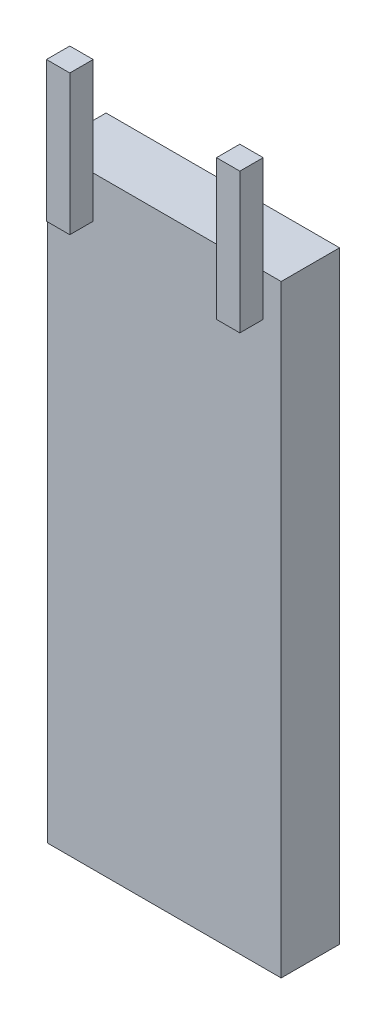
ISO-10303-21;
HEADER;
FILE_DESCRIPTION(('STEP AP214'),'2;1');
FILE_NAME('part.step','',(''),(''),'','','');
FILE_SCHEMA(('AUTOMOTIVE_DESIGN { 1 0 10303 214 1 1 1 1 }'));
ENDSEC;
DATA;
#1=APPLICATION_CONTEXT('core data for automotive mechanical design processes');
#2=APPLICATION_PROTOCOL_DEFINITION('international standard','automotive_design',2000,#1);
#3=PRODUCT_CONTEXT('',#1,'mechanical');
#4=PRODUCT('Part','Part','',(#3));
#5=PRODUCT_RELATED_PRODUCT_CATEGORY('part','',(#4));
#6=PRODUCT_DEFINITION_FORMATION('','',#4);
#7=PRODUCT_DEFINITION_CONTEXT('part definition',#1,'design');
#8=PRODUCT_DEFINITION('design','',#6,#7);
#9=PRODUCT_DEFINITION_SHAPE('','',#8);
#10=(LENGTH_UNIT() NAMED_UNIT(*) SI_UNIT(.MILLI.,.METRE.));
#11=(NAMED_UNIT(*) PLANE_ANGLE_UNIT() SI_UNIT($,.RADIAN.));
#12=(NAMED_UNIT(*) SI_UNIT($,.STERADIAN.) SOLID_ANGLE_UNIT());
#13=UNCERTAINTY_MEASURE_WITH_UNIT(LENGTH_MEASURE(1.E-05),#10,'distance_accuracy_value','');
#14=(GEOMETRIC_REPRESENTATION_CONTEXT(3) GLOBAL_UNCERTAINTY_ASSIGNED_CONTEXT((#13)) GLOBAL_UNIT_ASSIGNED_CONTEXT((#10,
#11,#12)) REPRESENTATION_CONTEXT('',''));
#15=CARTESIAN_POINT('',(0.,0.,0.));
#16=DIRECTION('',(0.,0.,1.));
#17=DIRECTION('',(1.,0.,0.));
#18=AXIS2_PLACEMENT_3D('',#15,#16,#17);
#19=CARTESIAN_POINT('',(0.,0.,0.));
#20=DIRECTION('',(0.,0.,1.));
#21=DIRECTION('',(1.,0.,0.));
#22=AXIS2_PLACEMENT_3D('',#19,#20,#21);
#23=PLANE('',#22);
#24=DIRECTION('',(-1.,0.,0.));
#25=VECTOR('',#24,1.);
#26=CARTESIAN_POINT('',(1.99990671308677,11.5,0.));
#27=LINE('',#26,#25);
#28=CARTESIAN_POINT('',(2.59990671308677,11.5,0.));
#29=VERTEX_POINT('',#28);
#30=CARTESIAN_POINT('',(1.99990671308677,11.5,0.));
#31=VERTEX_POINT('',#30);
#32=EDGE_CURVE('E154',#29,#31,#27,.T.);
#33=ORIENTED_EDGE('',*,*,#32,.T.);
#34=DIRECTION('',(0.,-1.,0.));
#35=VECTOR('',#34,1.);
#36=CARTESIAN_POINT('',(1.99990671308677,15.1,0.));
#37=LINE('',#36,#35);
#38=CARTESIAN_POINT('',(1.99990671308677,12.575,0.));
#39=VERTEX_POINT('',#38);
#40=EDGE_CURVE('E255',#39,#31,#37,.T.);
#41=ORIENTED_EDGE('',*,*,#40,.F.);
#42=DIRECTION('',(1.,0.,0.));
#43=VECTOR('',#42,1.);
#44=CARTESIAN_POINT('',(3.06228777493067,12.575,0.));
#45=LINE('',#44,#43);
#46=CARTESIAN_POINT('',(-1.76899203918877,12.575,0.));
#47=VERTEX_POINT('',#46);
#48=EDGE_CURVE('E251',#47,#39,#45,.T.);
#49=ORIENTED_EDGE('',*,*,#48,.F.);
#50=DIRECTION('',(0.,-1.,0.));
#51=VECTOR('',#50,1.);
#52=CARTESIAN_POINT('',(-1.76899203918877,15.1,0.));
#53=LINE('',#52,#51);
#54=CARTESIAN_POINT('',(-1.76899203918877,11.5,0.));
#55=VERTEX_POINT('',#54);
#56=EDGE_CURVE('E186',#47,#55,#53,.T.);
#57=ORIENTED_EDGE('',*,*,#56,.T.);
#58=DIRECTION('',(-1.,0.,0.));
#59=VECTOR('',#58,1.);
#60=CARTESIAN_POINT('',(-2.36899203918877,11.5,0.));
#61=LINE('',#60,#59);
#62=CARTESIAN_POINT('',(-2.36899203918877,11.5,0.));
#63=VERTEX_POINT('',#62);
#64=EDGE_CURVE('E171',#55,#63,#61,.T.);
#65=ORIENTED_EDGE('',*,*,#64,.T.);
#66=DIRECTION('',(0.,-1.,0.));
#67=VECTOR('',#66,1.);
#68=CARTESIAN_POINT('',(-2.36899203918877,15.1,0.));
#69=LINE('',#68,#67);
#70=CARTESIAN_POINT('',(-2.36899203918877,12.575,0.));
#71=VERTEX_POINT('',#70);
#72=EDGE_CURVE('E176',#71,#63,#69,.T.);
#73=ORIENTED_EDGE('',*,*,#72,.F.);
#74=CARTESIAN_POINT('',(-2.93771222506933,12.575,0.));
#75=VERTEX_POINT('',#74);
#76=EDGE_CURVE('E199',#75,#71,#45,.T.);
#77=ORIENTED_EDGE('',*,*,#76,.F.);
#78=DIRECTION('',(0.,1.,0.));
#79=VECTOR('',#78,1.);
#80=CARTESIAN_POINT('',(-2.93771222506933,-2.925,0.));
#81=LINE('',#80,#79);
#82=CARTESIAN_POINT('',(-2.93771222506933,-2.925,0.));
#83=VERTEX_POINT('',#82);
#84=EDGE_CURVE('E210',#83,#75,#81,.T.);
#85=ORIENTED_EDGE('',*,*,#84,.F.);
#86=DIRECTION('',(-1.,0.,0.));
#87=VECTOR('',#86,1.);
#88=CARTESIAN_POINT('',(3.06228777493067,-2.925,0.));
#89=LINE('',#88,#87);
#90=CARTESIAN_POINT('',(3.06228777493067,-2.925,0.));
#91=VERTEX_POINT('',#90);
#92=EDGE_CURVE('E208',#91,#83,#89,.T.);
#93=ORIENTED_EDGE('',*,*,#92,.F.);
#94=DIRECTION('',(0.,-1.,0.));
#95=VECTOR('',#94,1.);
#96=CARTESIAN_POINT('',(3.06228777493067,-2.925,0.));
#97=LINE('',#96,#95);
#98=CARTESIAN_POINT('',(3.06228777493067,12.575,0.));
#99=VERTEX_POINT('',#98);
#100=EDGE_CURVE('E194',#99,#91,#97,.T.);
#101=ORIENTED_EDGE('',*,*,#100,.F.);
#102=CARTESIAN_POINT('',(2.59990671308677,12.575,0.));
#103=VERTEX_POINT('',#102);
#104=EDGE_CURVE('E212',#103,#99,#45,.T.);
#105=ORIENTED_EDGE('',*,*,#104,.F.);
#106=DIRECTION('',(0.,-1.,0.));
#107=VECTOR('',#106,1.);
#108=CARTESIAN_POINT('',(2.59990671308677,15.1,0.));
#109=LINE('',#108,#107);
#110=EDGE_CURVE('E248',#103,#29,#109,.T.);
#111=ORIENTED_EDGE('',*,*,#110,.T.);
#112=EDGE_LOOP('',(#33,#41,#49,#57,#65,#73,#77,#85,#93,#101,#105,#111));
#113=FACE_BOUND('',#112,.T.);
#114=ADVANCED_FACE('F32',(#113),#23,.T.);
#115=CARTESIAN_POINT('',(3.06228777493067,-2.925,-1.5));
#116=DIRECTION('',(-1.,0.,0.));
#117=DIRECTION('',(0.,0.,1.));
#118=AXIS2_PLACEMENT_3D('',#115,#116,#117);
#119=PLANE('',#118);
#120=ORIENTED_EDGE('',*,*,#100,.T.);
#121=DIRECTION('',(0.,0.,1.));
#122=VECTOR('',#121,1.);
#123=CARTESIAN_POINT('',(3.06228777493067,-2.925,-1.5));
#124=LINE('',#123,#122);
#125=CARTESIAN_POINT('',(3.06228777493067,-2.925,-1.5));
#126=VERTEX_POINT('',#125);
#127=EDGE_CURVE('E11',#126,#91,#124,.T.);
#128=ORIENTED_EDGE('',*,*,#127,.F.);
#129=DIRECTION('',(0.,-1.,0.));
#130=VECTOR('',#129,1.);
#131=CARTESIAN_POINT('',(3.06228777493067,-2.925,-1.5));
#132=LINE('',#131,#130);
#133=CARTESIAN_POINT('',(3.06228777493067,12.575,-1.5));
#134=VERTEX_POINT('',#133);
#135=EDGE_CURVE('E195',#134,#126,#132,.T.);
#136=ORIENTED_EDGE('',*,*,#135,.F.);
#137=DIRECTION('',(0.,0.,1.));
#138=VECTOR('',#137,1.);
#139=CARTESIAN_POINT('',(3.06228777493067,12.575,-1.5));
#140=LINE('',#139,#138);
#141=EDGE_CURVE('E205',#134,#99,#140,.T.);
#142=ORIENTED_EDGE('',*,*,#141,.T.);
#143=EDGE_LOOP('',(#120,#128,#136,#142));
#144=FACE_BOUND('',#143,.T.);
#145=ADVANCED_FACE('F34',(#144),#119,.F.);
#146=CARTESIAN_POINT('',(3.06228777493067,-2.925,-1.5));
#147=DIRECTION('',(0.,1.,0.));
#148=DIRECTION('',(0.,0.,1.));
#149=AXIS2_PLACEMENT_3D('',#146,#147,#148);
#150=PLANE('',#149);
#151=ORIENTED_EDGE('',*,*,#92,.T.);
#152=DIRECTION('',(0.,0.,1.));
#153=VECTOR('',#152,1.);
#154=CARTESIAN_POINT('',(-2.93771222506933,-2.925,-1.5));
#155=LINE('',#154,#153);
#156=CARTESIAN_POINT('',(-2.93771222506933,-2.925,-1.5));
#157=VERTEX_POINT('',#156);
#158=EDGE_CURVE('E40',#157,#83,#155,.T.);
#159=ORIENTED_EDGE('',*,*,#158,.F.);
#160=DIRECTION('',(-1.,0.,0.));
#161=VECTOR('',#160,1.);
#162=CARTESIAN_POINT('',(3.06228777493067,-2.925,-1.5));
#163=LINE('',#162,#161);
#164=EDGE_CURVE('E198',#126,#157,#163,.T.);
#165=ORIENTED_EDGE('',*,*,#164,.F.);
#166=ORIENTED_EDGE('',*,*,#127,.T.);
#167=EDGE_LOOP('',(#151,#159,#165,#166));
#168=FACE_BOUND('',#167,.T.);
#169=ADVANCED_FACE('F243',(#168),#150,.F.);
#170=CARTESIAN_POINT('',(-2.93771222506933,-2.925,-1.5));
#171=DIRECTION('',(1.,0.,0.));
#172=DIRECTION('',(0.,1.,0.));
#173=AXIS2_PLACEMENT_3D('',#170,#171,#172);
#174=PLANE('',#173);
#175=ORIENTED_EDGE('',*,*,#84,.T.);
#176=DIRECTION('',(0.,0.,1.));
#177=VECTOR('',#176,1.);
#178=CARTESIAN_POINT('',(-2.93771222506933,12.575,-1.5));
#179=LINE('',#178,#177);
#180=CARTESIAN_POINT('',(-2.93771222506933,12.575,-1.5));
#181=VERTEX_POINT('',#180);
#182=EDGE_CURVE('E218',#181,#75,#179,.T.);
#183=ORIENTED_EDGE('',*,*,#182,.F.);
#184=DIRECTION('',(0.,1.,0.));
#185=VECTOR('',#184,1.);
#186=CARTESIAN_POINT('',(-2.93771222506933,-2.925,-1.5));
#187=LINE('',#186,#185);
#188=EDGE_CURVE('E201',#157,#181,#187,.T.);
#189=ORIENTED_EDGE('',*,*,#188,.F.);
#190=ORIENTED_EDGE('',*,*,#158,.T.);
#191=EDGE_LOOP('',(#175,#183,#189,#190));
#192=FACE_BOUND('',#191,.T.);
#193=ADVANCED_FACE('F225',(#192),#174,.F.);
#194=CARTESIAN_POINT('',(3.06228777493067,12.575,-1.5));
#195=DIRECTION('',(0.,-1.,0.));
#196=DIRECTION('',(0.,0.,-1.));
#197=AXIS2_PLACEMENT_3D('',#194,#195,#196);
#198=PLANE('',#197);
#199=ORIENTED_EDGE('',*,*,#76,.T.);
#200=EDGE_CURVE('E215',#71,#47,#45,.T.);
#201=ORIENTED_EDGE('',*,*,#200,.T.);
#202=ORIENTED_EDGE('',*,*,#48,.T.);
#203=EDGE_CURVE('E249',#39,#103,#45,.T.);
#204=ORIENTED_EDGE('',*,*,#203,.T.);
#205=ORIENTED_EDGE('',*,*,#104,.T.);
#206=ORIENTED_EDGE('',*,*,#141,.F.);
#207=DIRECTION('',(1.,0.,0.));
#208=VECTOR('',#207,1.);
#209=CARTESIAN_POINT('',(3.06228777493067,12.575,-1.5));
#210=LINE('',#209,#208);
#211=EDGE_CURVE('E203',#181,#134,#210,.T.);
#212=ORIENTED_EDGE('',*,*,#211,.F.);
#213=ORIENTED_EDGE('',*,*,#182,.T.);
#214=EDGE_LOOP('',(#199,#201,#202,#204,#205,#206,#212,#213));
#215=FACE_BOUND('',#214,.T.);
#216=ADVANCED_FACE('F235',(#215),#198,.F.);
#217=CARTESIAN_POINT('',(0.,0.,-1.5));
#218=DIRECTION('',(0.,0.,1.));
#219=DIRECTION('',(1.,0.,0.));
#220=AXIS2_PLACEMENT_3D('',#217,#218,#219);
#221=PLANE('',#220);
#222=ORIENTED_EDGE('',*,*,#135,.T.);
#223=ORIENTED_EDGE('',*,*,#164,.T.);
#224=ORIENTED_EDGE('',*,*,#188,.T.);
#225=ORIENTED_EDGE('',*,*,#211,.T.);
#226=EDGE_LOOP('',(#222,#223,#224,#225));
#227=FACE_BOUND('',#226,.T.);
#228=ADVANCED_FACE('F241',(#227),#221,.F.);
#229=CARTESIAN_POINT('',(-2.36899203918877,15.1,0.));
#230=DIRECTION('',(0.,0.,1.));
#231=DIRECTION('',(1.,0.,0.));
#232=AXIS2_PLACEMENT_3D('',#229,#230,#231);
#233=PLANE('',#232);
#234=CARTESIAN_POINT('',(-1.76899203918877,15.1,0.));
#235=VERTEX_POINT('',#234);
#236=EDGE_CURVE('E55',#235,#47,#53,.T.);
#237=ORIENTED_EDGE('',*,*,#236,.T.);
#238=ORIENTED_EDGE('',*,*,#200,.F.);
#239=CARTESIAN_POINT('',(-2.36899203918877,15.1,0.));
#240=VERTEX_POINT('',#239);
#241=EDGE_CURVE('E183',#240,#71,#69,.T.);
#242=ORIENTED_EDGE('',*,*,#241,.F.);
#243=DIRECTION('',(-1.,0.,0.));
#244=VECTOR('',#243,1.);
#245=CARTESIAN_POINT('',(-2.36899203918877,15.1,0.));
#246=LINE('',#245,#244);
#247=EDGE_CURVE('E175',#235,#240,#246,.T.);
#248=ORIENTED_EDGE('',*,*,#247,.F.);
#249=EDGE_LOOP('',(#237,#238,#242,#248));
#250=FACE_BOUND('',#249,.T.);
#251=ADVANCED_FACE('F310',(#250),#233,.F.);
#252=CARTESIAN_POINT('',(-2.36899203918877,15.1,0.));
#253=DIRECTION('',(1.,0.,0.));
#254=DIRECTION('',(0.,0.,-1.));
#255=AXIS2_PLACEMENT_3D('',#252,#253,#254);
#256=PLANE('',#255);
#257=DIRECTION('',(0.,0.,1.));
#258=VECTOR('',#257,1.);
#259=CARTESIAN_POINT('',(-2.36899203918877,11.5,0.));
#260=LINE('',#259,#258);
#261=CARTESIAN_POINT('',(-2.36899203918877,11.5,0.6));
#262=VERTEX_POINT('',#261);
#263=EDGE_CURVE('E159',#63,#262,#260,.T.);
#264=ORIENTED_EDGE('',*,*,#263,.T.);
#265=DIRECTION('',(0.,-1.,0.));
#266=VECTOR('',#265,1.);
#267=CARTESIAN_POINT('',(-2.36899203918877,15.1,0.6));
#268=LINE('',#267,#266);
#269=CARTESIAN_POINT('',(-2.36899203918877,15.1,0.6));
#270=VERTEX_POINT('',#269);
#271=EDGE_CURVE('E191',#270,#262,#268,.T.);
#272=ORIENTED_EDGE('',*,*,#271,.F.);
#273=DIRECTION('',(0.,0.,1.));
#274=VECTOR('',#273,1.);
#275=CARTESIAN_POINT('',(-2.36899203918877,15.1,0.));
#276=LINE('',#275,#274);
#277=EDGE_CURVE('E167',#240,#270,#276,.T.);
#278=ORIENTED_EDGE('',*,*,#277,.F.);
#279=ORIENTED_EDGE('',*,*,#241,.T.);
#280=ORIENTED_EDGE('',*,*,#72,.T.);
#281=EDGE_LOOP('',(#264,#272,#278,#279,#280));
#282=FACE_BOUND('',#281,.T.);
#283=ADVANCED_FACE('F315',(#282),#256,.F.);
#284=CARTESIAN_POINT('',(-2.36899203918877,15.1,0.6));
#285=DIRECTION('',(0.,0.,-1.));
#286=DIRECTION('',(-1.,0.,0.));
#287=AXIS2_PLACEMENT_3D('',#284,#285,#286);
#288=PLANE('',#287);
#289=DIRECTION('',(1.,0.,0.));
#290=VECTOR('',#289,1.);
#291=CARTESIAN_POINT('',(-2.36899203918877,11.5,0.6));
#292=LINE('',#291,#290);
#293=CARTESIAN_POINT('',(-1.76899203918877,11.5,0.6));
#294=VERTEX_POINT('',#293);
#295=EDGE_CURVE('E162',#262,#294,#292,.T.);
#296=ORIENTED_EDGE('',*,*,#295,.T.);
#297=DIRECTION('',(0.,-1.,0.));
#298=VECTOR('',#297,1.);
#299=CARTESIAN_POINT('',(-1.76899203918877,15.1,0.6));
#300=LINE('',#299,#298);
#301=CARTESIAN_POINT('',(-1.76899203918877,15.1,0.6));
#302=VERTEX_POINT('',#301);
#303=EDGE_CURVE('E188',#302,#294,#300,.T.);
#304=ORIENTED_EDGE('',*,*,#303,.F.);
#305=DIRECTION('',(1.,0.,0.));
#306=VECTOR('',#305,1.);
#307=CARTESIAN_POINT('',(-2.36899203918877,15.1,0.6));
#308=LINE('',#307,#306);
#309=EDGE_CURVE('E170',#270,#302,#308,.T.);
#310=ORIENTED_EDGE('',*,*,#309,.F.);
#311=ORIENTED_EDGE('',*,*,#271,.T.);
#312=EDGE_LOOP('',(#296,#304,#310,#311));
#313=FACE_BOUND('',#312,.T.);
#314=ADVANCED_FACE('F322',(#313),#288,.F.);
#315=CARTESIAN_POINT('',(-1.76899203918877,15.1,0.));
#316=DIRECTION('',(-1.,0.,0.));
#317=DIRECTION('',(0.,0.,1.));
#318=AXIS2_PLACEMENT_3D('',#315,#316,#317);
#319=PLANE('',#318);
#320=DIRECTION('',(0.,0.,-1.));
#321=VECTOR('',#320,1.);
#322=CARTESIAN_POINT('',(-1.76899203918877,11.5,0.));
#323=LINE('',#322,#321);
#324=EDGE_CURVE('E179',#294,#55,#323,.T.);
#325=ORIENTED_EDGE('',*,*,#324,.T.);
#326=ORIENTED_EDGE('',*,*,#56,.F.);
#327=ORIENTED_EDGE('',*,*,#236,.F.);
#328=DIRECTION('',(0.,0.,-1.));
#329=VECTOR('',#328,1.);
#330=CARTESIAN_POINT('',(-1.76899203918877,15.1,0.));
#331=LINE('',#330,#329);
#332=EDGE_CURVE('E173',#302,#235,#331,.T.);
#333=ORIENTED_EDGE('',*,*,#332,.F.);
#334=ORIENTED_EDGE('',*,*,#303,.T.);
#335=EDGE_LOOP('',(#325,#326,#327,#333,#334));
#336=FACE_BOUND('',#335,.T.);
#337=ADVANCED_FACE('F329',(#336),#319,.F.);
#338=CARTESIAN_POINT('',(0.,15.1,0.));
#339=DIRECTION('',(0.,1.,0.));
#340=DIRECTION('',(0.,0.,1.));
#341=AXIS2_PLACEMENT_3D('',#338,#339,#340);
#342=PLANE('',#341);
#343=ORIENTED_EDGE('',*,*,#277,.T.);
#344=ORIENTED_EDGE('',*,*,#309,.T.);
#345=ORIENTED_EDGE('',*,*,#332,.T.);
#346=ORIENTED_EDGE('',*,*,#247,.T.);
#347=EDGE_LOOP('',(#343,#344,#345,#346));
#348=FACE_BOUND('',#347,.T.);
#349=ADVANCED_FACE('F337',(#348),#342,.T.);
#350=CARTESIAN_POINT('',(0.,11.5,0.));
#351=DIRECTION('',(0.,1.,0.));
#352=DIRECTION('',(0.,0.,1.));
#353=AXIS2_PLACEMENT_3D('',#350,#351,#352);
#354=PLANE('',#353);
#355=ORIENTED_EDGE('',*,*,#263,.F.);
#356=ORIENTED_EDGE('',*,*,#64,.F.);
#357=ORIENTED_EDGE('',*,*,#324,.F.);
#358=ORIENTED_EDGE('',*,*,#295,.F.);
#359=EDGE_LOOP('',(#355,#356,#357,#358));
#360=FACE_BOUND('',#359,.T.);
#361=ADVANCED_FACE('F345',(#360),#354,.F.);
#362=CARTESIAN_POINT('',(1.99990671308677,15.1,0.));
#363=DIRECTION('',(0.,0.,1.));
#364=DIRECTION('',(1.,0.,0.));
#365=AXIS2_PLACEMENT_3D('',#362,#363,#364);
#366=PLANE('',#365);
#367=CARTESIAN_POINT('',(2.59990671308677,15.1,0.));
#368=VERTEX_POINT('',#367);
#369=EDGE_CURVE('E47',#368,#103,#109,.T.);
#370=ORIENTED_EDGE('',*,*,#369,.T.);
#371=ORIENTED_EDGE('',*,*,#203,.F.);
#372=CARTESIAN_POINT('',(1.99990671308677,15.1,0.));
#373=VERTEX_POINT('',#372);
#374=EDGE_CURVE('E253',#373,#39,#37,.T.);
#375=ORIENTED_EDGE('',*,*,#374,.F.);
#376=DIRECTION('',(-1.,0.,0.));
#377=VECTOR('',#376,1.);
#378=CARTESIAN_POINT('',(1.99990671308677,15.1,0.));
#379=LINE('',#378,#377);
#380=EDGE_CURVE('E150',#368,#373,#379,.T.);
#381=ORIENTED_EDGE('',*,*,#380,.F.);
#382=EDGE_LOOP('',(#370,#371,#375,#381));
#383=FACE_BOUND('',#382,.T.);
#384=ADVANCED_FACE('F252',(#383),#366,.F.);
#385=CARTESIAN_POINT('',(1.99990671308677,15.1,0.));
#386=DIRECTION('',(1.,0.,0.));
#387=DIRECTION('',(0.,0.,-1.));
#388=AXIS2_PLACEMENT_3D('',#385,#386,#387);
#389=PLANE('',#388);
#390=DIRECTION('',(0.,0.,1.));
#391=VECTOR('',#390,1.);
#392=CARTESIAN_POINT('',(1.99990671308677,11.5,0.));
#393=LINE('',#392,#391);
#394=CARTESIAN_POINT('',(1.99990671308677,11.5,0.6));
#395=VERTEX_POINT('',#394);
#396=EDGE_CURVE('E158',#31,#395,#393,.T.);
#397=ORIENTED_EDGE('',*,*,#396,.T.);
#398=DIRECTION('',(0.,-1.,0.));
#399=VECTOR('',#398,1.);
#400=CARTESIAN_POINT('',(1.99990671308677,15.1,0.6));
#401=LINE('',#400,#399);
#402=CARTESIAN_POINT('',(1.99990671308677,15.1,0.6));
#403=VERTEX_POINT('',#402);
#404=EDGE_CURVE('E139',#403,#395,#401,.T.);
#405=ORIENTED_EDGE('',*,*,#404,.F.);
#406=DIRECTION('',(0.,0.,1.));
#407=VECTOR('',#406,1.);
#408=CARTESIAN_POINT('',(1.99990671308677,15.1,0.));
#409=LINE('',#408,#407);
#410=EDGE_CURVE('E146',#373,#403,#409,.T.);
#411=ORIENTED_EDGE('',*,*,#410,.F.);
#412=ORIENTED_EDGE('',*,*,#374,.T.);
#413=ORIENTED_EDGE('',*,*,#40,.T.);
#414=EDGE_LOOP('',(#397,#405,#411,#412,#413));
#415=FACE_BOUND('',#414,.T.);
#416=ADVANCED_FACE('F156',(#415),#389,.F.);
#417=CARTESIAN_POINT('',(1.99990671308677,15.1,0.6));
#418=DIRECTION('',(0.,0.,-1.));
#419=DIRECTION('',(-1.,0.,0.));
#420=AXIS2_PLACEMENT_3D('',#417,#418,#419);
#421=PLANE('',#420);
#422=DIRECTION('',(1.,0.,0.));
#423=VECTOR('',#422,1.);
#424=CARTESIAN_POINT('',(1.99990671308677,11.5,0.6));
#425=LINE('',#424,#423);
#426=CARTESIAN_POINT('',(2.59990671308677,11.5,0.6));
#427=VERTEX_POINT('',#426);
#428=EDGE_CURVE('E264',#395,#427,#425,.T.);
#429=ORIENTED_EDGE('',*,*,#428,.T.);
#430=DIRECTION('',(0.,-1.,0.));
#431=VECTOR('',#430,1.);
#432=CARTESIAN_POINT('',(2.59990671308677,15.1,0.6));
#433=LINE('',#432,#431);
#434=CARTESIAN_POINT('',(2.59990671308677,15.1,0.6));
#435=VERTEX_POINT('',#434);
#436=EDGE_CURVE('E142',#435,#427,#433,.T.);
#437=ORIENTED_EDGE('',*,*,#436,.F.);
#438=DIRECTION('',(1.,0.,0.));
#439=VECTOR('',#438,1.);
#440=CARTESIAN_POINT('',(1.99990671308677,15.1,0.6));
#441=LINE('',#440,#439);
#442=EDGE_CURVE('E135',#403,#435,#441,.T.);
#443=ORIENTED_EDGE('',*,*,#442,.F.);
#444=ORIENTED_EDGE('',*,*,#404,.T.);
#445=EDGE_LOOP('',(#429,#437,#443,#444));
#446=FACE_BOUND('',#445,.T.);
#447=ADVANCED_FACE('F137',(#446),#421,.F.);
#448=CARTESIAN_POINT('',(2.59990671308677,15.1,0.));
#449=DIRECTION('',(-1.,0.,0.));
#450=DIRECTION('',(0.,0.,1.));
#451=AXIS2_PLACEMENT_3D('',#448,#449,#450);
#452=PLANE('',#451);
#453=DIRECTION('',(0.,0.,-1.));
#454=VECTOR('',#453,1.);
#455=CARTESIAN_POINT('',(2.59990671308677,11.5,0.));
#456=LINE('',#455,#454);
#457=EDGE_CURVE('E262',#427,#29,#456,.T.);
#458=ORIENTED_EDGE('',*,*,#457,.T.);
#459=ORIENTED_EDGE('',*,*,#110,.F.);
#460=ORIENTED_EDGE('',*,*,#369,.F.);
#461=DIRECTION('',(0.,0.,-1.));
#462=VECTOR('',#461,1.);
#463=CARTESIAN_POINT('',(2.59990671308677,15.1,0.));
#464=LINE('',#463,#462);
#465=EDGE_CURVE('E145',#435,#368,#464,.T.);
#466=ORIENTED_EDGE('',*,*,#465,.F.);
#467=ORIENTED_EDGE('',*,*,#436,.T.);
#468=EDGE_LOOP('',(#458,#459,#460,#466,#467));
#469=FACE_BOUND('',#468,.T.);
#470=ADVANCED_FACE('F268',(#469),#452,.F.);
#471=CARTESIAN_POINT('',(0.,15.1,0.));
#472=DIRECTION('',(0.,1.,0.));
#473=DIRECTION('',(0.,0.,1.));
#474=AXIS2_PLACEMENT_3D('',#471,#472,#473);
#475=PLANE('',#474);
#476=ORIENTED_EDGE('',*,*,#410,.T.);
#477=ORIENTED_EDGE('',*,*,#442,.T.);
#478=ORIENTED_EDGE('',*,*,#465,.T.);
#479=ORIENTED_EDGE('',*,*,#380,.T.);
#480=EDGE_LOOP('',(#476,#477,#478,#479));
#481=FACE_BOUND('',#480,.T.);
#482=ADVANCED_FACE('F149',(#481),#475,.T.);
#483=CARTESIAN_POINT('',(0.,11.5,0.));
#484=DIRECTION('',(0.,1.,0.));
#485=DIRECTION('',(0.,0.,1.));
#486=AXIS2_PLACEMENT_3D('',#483,#484,#485);
#487=PLANE('',#486);
#488=ORIENTED_EDGE('',*,*,#396,.F.);
#489=ORIENTED_EDGE('',*,*,#32,.F.);
#490=ORIENTED_EDGE('',*,*,#457,.F.);
#491=ORIENTED_EDGE('',*,*,#428,.F.);
#492=EDGE_LOOP('',(#488,#489,#490,#491));
#493=FACE_BOUND('',#492,.T.);
#494=ADVANCED_FACE('F271',(#493),#487,.F.);
#495=CLOSED_SHELL('',(#114,#145,#169,#193,#216,#228,#251,#283,#314,#337,#349,#361,#384,#416,
#447,#470,#482,#494));
#496=MANIFOLD_SOLID_BREP('B2',#495);
#497=ADVANCED_BREP_SHAPE_REPRESENTATION('',(#18,#496),#14);
#498=SHAPE_DEFINITION_REPRESENTATION(#9,#497);
ENDSEC;
END-ISO-10303-21;
